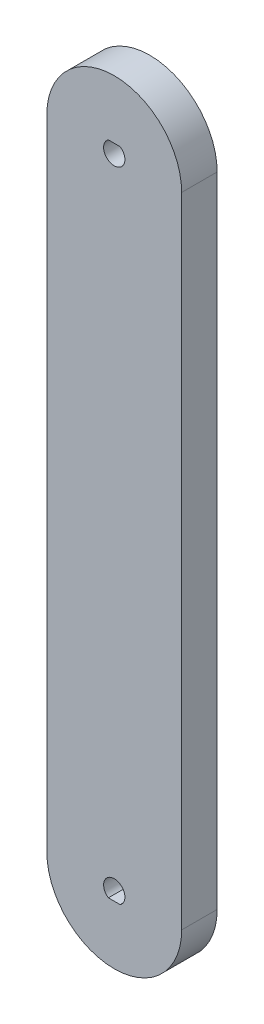
ISO-10303-21;
HEADER;
FILE_DESCRIPTION(('STEP AP214'),'2;1');
FILE_NAME('part.step','',(''),(''),'','','');
FILE_SCHEMA(('AUTOMOTIVE_DESIGN { 1 0 10303 214 1 1 1 1 }'));
ENDSEC;
DATA;
#1=APPLICATION_CONTEXT('core data for automotive mechanical design processes');
#2=APPLICATION_PROTOCOL_DEFINITION('international standard','automotive_design',2000,#1);
#3=PRODUCT_CONTEXT('',#1,'mechanical');
#4=PRODUCT('Part','Part','',(#3));
#5=PRODUCT_RELATED_PRODUCT_CATEGORY('part','',(#4));
#6=PRODUCT_DEFINITION_FORMATION('','',#4);
#7=PRODUCT_DEFINITION_CONTEXT('part definition',#1,'design');
#8=PRODUCT_DEFINITION('design','',#6,#7);
#9=PRODUCT_DEFINITION_SHAPE('','',#8);
#10=(LENGTH_UNIT() NAMED_UNIT(*) SI_UNIT(.MILLI.,.METRE.));
#11=(NAMED_UNIT(*) PLANE_ANGLE_UNIT() SI_UNIT($,.RADIAN.));
#12=(NAMED_UNIT(*) SI_UNIT($,.STERADIAN.) SOLID_ANGLE_UNIT());
#13=UNCERTAINTY_MEASURE_WITH_UNIT(LENGTH_MEASURE(1.E-05),#10,'distance_accuracy_value','');
#14=(GEOMETRIC_REPRESENTATION_CONTEXT(3) GLOBAL_UNCERTAINTY_ASSIGNED_CONTEXT((#13)) GLOBAL_UNIT_ASSIGNED_CONTEXT((#10,
#11,#12)) REPRESENTATION_CONTEXT('',''));
#15=CARTESIAN_POINT('',(0.,0.,0.));
#16=DIRECTION('',(0.,0.,1.));
#17=DIRECTION('',(1.,0.,0.));
#18=AXIS2_PLACEMENT_3D('',#15,#16,#17);
#19=CARTESIAN_POINT('',(-19.,0.,10.));
#20=DIRECTION('',(1.,0.,0.));
#21=DIRECTION('',(0.,1.,0.));
#22=AXIS2_PLACEMENT_3D('',#19,#20,#21);
#23=PLANE('',#22);
#24=DIRECTION('',(0.,-1.,0.));
#25=VECTOR('',#24,1.);
#26=CARTESIAN_POINT('',(-19.,0.,0.));
#27=LINE('',#26,#25);
#28=CARTESIAN_POINT('',(-19.,90.,0.));
#29=VERTEX_POINT('',#28);
#30=CARTESIAN_POINT('',(-19.,-90.,0.));
#31=VERTEX_POINT('',#30);
#32=EDGE_CURVE('E144',#29,#31,#27,.T.);
#33=ORIENTED_EDGE('',*,*,#32,.T.);
#34=DIRECTION('',(0.,0.,-1.));
#35=VECTOR('',#34,1.);
#36=CARTESIAN_POINT('',(-19.,-90.,10.));
#37=LINE('',#36,#35);
#38=CARTESIAN_POINT('',(-19.,-90.,10.));
#39=VERTEX_POINT('',#38);
#40=EDGE_CURVE('E11',#39,#31,#37,.T.);
#41=ORIENTED_EDGE('',*,*,#40,.F.);
#42=DIRECTION('',(0.,-1.,0.));
#43=VECTOR('',#42,1.);
#44=CARTESIAN_POINT('',(-19.,0.,10.));
#45=LINE('',#44,#43);
#46=CARTESIAN_POINT('',(-19.,90.,10.));
#47=VERTEX_POINT('',#46);
#48=EDGE_CURVE('E115',#47,#39,#45,.T.);
#49=ORIENTED_EDGE('',*,*,#48,.F.);
#50=DIRECTION('',(0.,0.,-1.));
#51=VECTOR('',#50,1.);
#52=CARTESIAN_POINT('',(-19.,90.,10.));
#53=LINE('',#52,#51);
#54=EDGE_CURVE('E152',#47,#29,#53,.T.);
#55=ORIENTED_EDGE('',*,*,#54,.T.);
#56=EDGE_LOOP('',(#33,#41,#49,#55));
#57=FACE_BOUND('',#56,.T.);
#58=ADVANCED_FACE('F38',(#57),#23,.F.);
#59=CARTESIAN_POINT('',(0.,-90.,10.));
#60=DIRECTION('',(0.,0.,-1.));
#61=DIRECTION('',(-1.,0.,0.));
#62=AXIS2_PLACEMENT_3D('',#59,#60,#61);
#63=CYLINDRICAL_SURFACE('',#62,19.);
#64=CARTESIAN_POINT('',(0.,-90.,0.));
#65=DIRECTION('',(0.,0.,1.));
#66=DIRECTION('',(1.,0.,0.));
#67=AXIS2_PLACEMENT_3D('',#64,#65,#66);
#68=CIRCLE('',#67,19.);
#69=CARTESIAN_POINT('',(19.,-90.,0.));
#70=VERTEX_POINT('',#69);
#71=EDGE_CURVE('E121',#31,#70,#68,.T.);
#72=ORIENTED_EDGE('',*,*,#71,.T.);
#73=DIRECTION('',(0.,0.,-1.));
#74=VECTOR('',#73,1.);
#75=CARTESIAN_POINT('',(19.,-90.,10.));
#76=LINE('',#75,#74);
#77=CARTESIAN_POINT('',(19.,-90.,10.));
#78=VERTEX_POINT('',#77);
#79=EDGE_CURVE('E48',#78,#70,#76,.T.);
#80=ORIENTED_EDGE('',*,*,#79,.F.);
#81=CARTESIAN_POINT('',(0.,-90.,10.));
#82=DIRECTION('',(0.,0.,1.));
#83=DIRECTION('',(1.,0.,0.));
#84=AXIS2_PLACEMENT_3D('',#81,#82,#83);
#85=CIRCLE('',#84,19.);
#86=EDGE_CURVE('E109',#39,#78,#85,.T.);
#87=ORIENTED_EDGE('',*,*,#86,.F.);
#88=ORIENTED_EDGE('',*,*,#40,.T.);
#89=EDGE_LOOP('',(#72,#80,#87,#88));
#90=FACE_BOUND('',#89,.T.);
#91=ADVANCED_FACE('F120',(#90),#63,.T.);
#92=CARTESIAN_POINT('',(19.,0.,10.));
#93=DIRECTION('',(1.,0.,0.));
#94=DIRECTION('',(0.,1.,0.));
#95=AXIS2_PLACEMENT_3D('',#92,#93,#94);
#96=PLANE('',#95);
#97=DIRECTION('',(0.,-1.,0.));
#98=VECTOR('',#97,1.);
#99=CARTESIAN_POINT('',(19.,0.,0.));
#100=LINE('',#99,#98);
#101=CARTESIAN_POINT('',(19.,90.,0.));
#102=VERTEX_POINT('',#101);
#103=EDGE_CURVE('E148',#102,#70,#100,.T.);
#104=ORIENTED_EDGE('',*,*,#103,.F.);
#105=DIRECTION('',(0.,0.,-1.));
#106=VECTOR('',#105,1.);
#107=CARTESIAN_POINT('',(19.,90.,10.));
#108=LINE('',#107,#106);
#109=CARTESIAN_POINT('',(19.,90.,10.));
#110=VERTEX_POINT('',#109);
#111=EDGE_CURVE('E85',#110,#102,#108,.T.);
#112=ORIENTED_EDGE('',*,*,#111,.F.);
#113=DIRECTION('',(0.,-1.,0.));
#114=VECTOR('',#113,1.);
#115=CARTESIAN_POINT('',(19.,0.,10.));
#116=LINE('',#115,#114);
#117=EDGE_CURVE('E113',#110,#78,#116,.T.);
#118=ORIENTED_EDGE('',*,*,#117,.T.);
#119=ORIENTED_EDGE('',*,*,#79,.T.);
#120=EDGE_LOOP('',(#104,#112,#118,#119));
#121=FACE_BOUND('',#120,.T.);
#122=ADVANCED_FACE('F126',(#121),#96,.T.);
#123=CARTESIAN_POINT('',(0.,90.,10.));
#124=DIRECTION('',(0.,0.,-1.));
#125=DIRECTION('',(-1.,0.,0.));
#126=AXIS2_PLACEMENT_3D('',#123,#124,#125);
#127=CYLINDRICAL_SURFACE('',#126,3.);
#128=CARTESIAN_POINT('',(0.,90.,0.));
#129=DIRECTION('',(0.,0.,1.));
#130=DIRECTION('',(1.,0.,0.));
#131=AXIS2_PLACEMENT_3D('',#128,#129,#130);
#132=CIRCLE('',#131,3.);
#133=CARTESIAN_POINT('',(-1.65831239517775,92.5,0.));
#134=VERTEX_POINT('',#133);
#135=CARTESIAN_POINT('',(1.65831239517774,92.5,0.));
#136=VERTEX_POINT('',#135);
#137=EDGE_CURVE('E138',#134,#136,#132,.T.);
#138=ORIENTED_EDGE('',*,*,#137,.F.);
#139=DIRECTION('',(0.,0.,-1.));
#140=VECTOR('',#139,1.);
#141=CARTESIAN_POINT('',(-1.65831239517775,92.5,10.));
#142=LINE('',#141,#140);
#143=CARTESIAN_POINT('',(-1.65831239517775,92.5,10.));
#144=VERTEX_POINT('',#143);
#145=EDGE_CURVE('E154',#144,#134,#142,.T.);
#146=ORIENTED_EDGE('',*,*,#145,.F.);
#147=CARTESIAN_POINT('',(0.,90.,10.));
#148=DIRECTION('',(0.,0.,1.));
#149=DIRECTION('',(1.,0.,0.));
#150=AXIS2_PLACEMENT_3D('',#147,#148,#149);
#151=CIRCLE('',#150,3.);
#152=CARTESIAN_POINT('',(1.65831239517774,92.5,10.));
#153=VERTEX_POINT('',#152);
#154=EDGE_CURVE('E206',#144,#153,#151,.T.);
#155=ORIENTED_EDGE('',*,*,#154,.T.);
#156=DIRECTION('',(0.,0.,-1.));
#157=VECTOR('',#156,1.);
#158=CARTESIAN_POINT('',(1.65831239517774,92.5,10.));
#159=LINE('',#158,#157);
#160=EDGE_CURVE('E156',#153,#136,#159,.T.);
#161=ORIENTED_EDGE('',*,*,#160,.T.);
#162=EDGE_LOOP('',(#138,#146,#155,#161));
#163=FACE_BOUND('',#162,.T.);
#164=ADVANCED_FACE('F195',(#163),#127,.F.);
#165=CARTESIAN_POINT('',(0.,-90.,10.));
#166=DIRECTION('',(0.,0.,-1.));
#167=DIRECTION('',(-1.,0.,0.));
#168=AXIS2_PLACEMENT_3D('',#165,#166,#167);
#169=CYLINDRICAL_SURFACE('',#168,3.);
#170=CARTESIAN_POINT('',(0.,-90.,0.));
#171=DIRECTION('',(0.,0.,1.));
#172=DIRECTION('',(1.,0.,0.));
#173=AXIS2_PLACEMENT_3D('',#170,#171,#172);
#174=CIRCLE('',#173,3.);
#175=CARTESIAN_POINT('',(1.65831239517769,-92.5,0.));
#176=VERTEX_POINT('',#175);
#177=CARTESIAN_POINT('',(-1.65831239517765,-92.5,0.));
#178=VERTEX_POINT('',#177);
#179=EDGE_CURVE('E132',#176,#178,#174,.T.);
#180=ORIENTED_EDGE('',*,*,#179,.F.);
#181=DIRECTION('',(0.,0.,-1.));
#182=VECTOR('',#181,1.);
#183=CARTESIAN_POINT('',(1.65831239517769,-92.5,10.));
#184=LINE('',#183,#182);
#185=CARTESIAN_POINT('',(1.65831239517769,-92.5,10.));
#186=VERTEX_POINT('',#185);
#187=EDGE_CURVE('E42',#186,#176,#184,.T.);
#188=ORIENTED_EDGE('',*,*,#187,.F.);
#189=CARTESIAN_POINT('',(0.,-90.,10.));
#190=DIRECTION('',(0.,0.,1.));
#191=DIRECTION('',(1.,0.,0.));
#192=AXIS2_PLACEMENT_3D('',#189,#190,#191);
#193=CIRCLE('',#192,3.);
#194=CARTESIAN_POINT('',(-1.65831239517765,-92.5,10.));
#195=VERTEX_POINT('',#194);
#196=EDGE_CURVE('E151',#186,#195,#193,.T.);
#197=ORIENTED_EDGE('',*,*,#196,.T.);
#198=DIRECTION('',(0.,0.,-1.));
#199=VECTOR('',#198,1.);
#200=CARTESIAN_POINT('',(-1.65831239517765,-92.5,10.));
#201=LINE('',#200,#199);
#202=EDGE_CURVE('E128',#195,#178,#201,.T.);
#203=ORIENTED_EDGE('',*,*,#202,.T.);
#204=EDGE_LOOP('',(#180,#188,#197,#203));
#205=FACE_BOUND('',#204,.T.);
#206=ADVANCED_FACE('F40',(#205),#169,.F.);
#207=CARTESIAN_POINT('',(0.,92.5,10.));
#208=DIRECTION('',(0.,1.,0.));
#209=DIRECTION('',(0.,0.,1.));
#210=AXIS2_PLACEMENT_3D('',#207,#208,#209);
#211=PLANE('',#210);
#212=DIRECTION('',(1.,0.,0.));
#213=VECTOR('',#212,1.);
#214=CARTESIAN_POINT('',(0.,92.5,0.));
#215=LINE('',#214,#213);
#216=EDGE_CURVE('E141',#134,#136,#215,.T.);
#217=ORIENTED_EDGE('',*,*,#216,.T.);
#218=ORIENTED_EDGE('',*,*,#160,.F.);
#219=DIRECTION('',(1.,0.,0.));
#220=VECTOR('',#219,1.);
#221=CARTESIAN_POINT('',(0.,92.5,10.));
#222=LINE('',#221,#220);
#223=EDGE_CURVE('E207',#144,#153,#222,.T.);
#224=ORIENTED_EDGE('',*,*,#223,.F.);
#225=ORIENTED_EDGE('',*,*,#145,.T.);
#226=EDGE_LOOP('',(#217,#218,#224,#225));
#227=FACE_BOUND('',#226,.T.);
#228=ADVANCED_FACE('F183',(#227),#211,.F.);
#229=CARTESIAN_POINT('',(0.,-92.5,10.));
#230=DIRECTION('',(0.,1.,0.));
#231=DIRECTION('',(0.,0.,1.));
#232=AXIS2_PLACEMENT_3D('',#229,#230,#231);
#233=PLANE('',#232);
#234=DIRECTION('',(1.,0.,0.));
#235=VECTOR('',#234,1.);
#236=CARTESIAN_POINT('',(0.,-92.5,0.));
#237=LINE('',#236,#235);
#238=EDGE_CURVE('E135',#178,#176,#237,.T.);
#239=ORIENTED_EDGE('',*,*,#238,.F.);
#240=ORIENTED_EDGE('',*,*,#202,.F.);
#241=DIRECTION('',(1.,0.,0.));
#242=VECTOR('',#241,1.);
#243=CARTESIAN_POINT('',(0.,-92.5,10.));
#244=LINE('',#243,#242);
#245=EDGE_CURVE('E163',#195,#186,#244,.T.);
#246=ORIENTED_EDGE('',*,*,#245,.T.);
#247=ORIENTED_EDGE('',*,*,#187,.T.);
#248=EDGE_LOOP('',(#239,#240,#246,#247));
#249=FACE_BOUND('',#248,.T.);
#250=ADVANCED_FACE('F161',(#249),#233,.T.);
#251=CARTESIAN_POINT('',(0.,90.,10.));
#252=DIRECTION('',(0.,0.,-1.));
#253=DIRECTION('',(-1.,0.,0.));
#254=AXIS2_PLACEMENT_3D('',#251,#252,#253);
#255=CYLINDRICAL_SURFACE('',#254,19.);
#256=CARTESIAN_POINT('',(0.,90.,0.));
#257=DIRECTION('',(0.,0.,1.));
#258=DIRECTION('',(1.,0.,0.));
#259=AXIS2_PLACEMENT_3D('',#256,#257,#258);
#260=CIRCLE('',#259,19.);
#261=EDGE_CURVE('E88',#102,#29,#260,.T.);
#262=ORIENTED_EDGE('',*,*,#261,.T.);
#263=ORIENTED_EDGE('',*,*,#54,.F.);
#264=CARTESIAN_POINT('',(0.,90.,10.));
#265=DIRECTION('',(0.,0.,1.));
#266=DIRECTION('',(1.,0.,0.));
#267=AXIS2_PLACEMENT_3D('',#264,#265,#266);
#268=CIRCLE('',#267,19.);
#269=EDGE_CURVE('E57',#110,#47,#268,.T.);
#270=ORIENTED_EDGE('',*,*,#269,.F.);
#271=ORIENTED_EDGE('',*,*,#111,.T.);
#272=EDGE_LOOP('',(#262,#263,#270,#271));
#273=FACE_BOUND('',#272,.T.);
#274=ADVANCED_FACE('F174',(#273),#255,.T.);
#275=CARTESIAN_POINT('',(0.,0.,10.));
#276=DIRECTION('',(0.,0.,1.));
#277=DIRECTION('',(1.,0.,0.));
#278=AXIS2_PLACEMENT_3D('',#275,#276,#277);
#279=PLANE('',#278);
#280=ORIENTED_EDGE('',*,*,#196,.F.);
#281=ORIENTED_EDGE('',*,*,#245,.F.);
#282=EDGE_LOOP('',(#280,#281));
#283=FACE_BOUND('',#282,.T.);
#284=ORIENTED_EDGE('',*,*,#154,.F.);
#285=ORIENTED_EDGE('',*,*,#223,.T.);
#286=EDGE_LOOP('',(#284,#285));
#287=FACE_BOUND('',#286,.T.);
#288=ORIENTED_EDGE('',*,*,#48,.T.);
#289=ORIENTED_EDGE('',*,*,#86,.T.);
#290=ORIENTED_EDGE('',*,*,#117,.F.);
#291=ORIENTED_EDGE('',*,*,#269,.T.);
#292=EDGE_LOOP('',(#288,#289,#290,#291));
#293=FACE_BOUND('',#292,.T.);
#294=ADVANCED_FACE('F111',(#283,#287,#293),#279,.T.);
#295=CARTESIAN_POINT('',(0.,0.,0.));
#296=DIRECTION('',(0.,0.,1.));
#297=DIRECTION('',(1.,0.,0.));
#298=AXIS2_PLACEMENT_3D('',#295,#296,#297);
#299=PLANE('',#298);
#300=ORIENTED_EDGE('',*,*,#179,.T.);
#301=ORIENTED_EDGE('',*,*,#238,.T.);
#302=EDGE_LOOP('',(#300,#301));
#303=FACE_BOUND('',#302,.T.);
#304=ORIENTED_EDGE('',*,*,#137,.T.);
#305=ORIENTED_EDGE('',*,*,#216,.F.);
#306=EDGE_LOOP('',(#304,#305));
#307=FACE_BOUND('',#306,.T.);
#308=ORIENTED_EDGE('',*,*,#32,.F.);
#309=ORIENTED_EDGE('',*,*,#261,.F.);
#310=ORIENTED_EDGE('',*,*,#103,.T.);
#311=ORIENTED_EDGE('',*,*,#71,.F.);
#312=EDGE_LOOP('',(#308,#309,#310,#311));
#313=FACE_BOUND('',#312,.T.);
#314=ADVANCED_FACE('F165',(#303,#307,#313),#299,.F.);
#315=CLOSED_SHELL('',(#58,#91,#122,#164,#206,#228,#250,#274,#294,#314));
#316=MANIFOLD_SOLID_BREP('B2',#315);
#317=ADVANCED_BREP_SHAPE_REPRESENTATION('',(#18,#316),#14);
#318=SHAPE_DEFINITION_REPRESENTATION(#9,#317);
ENDSEC;
END-ISO-10303-21;
